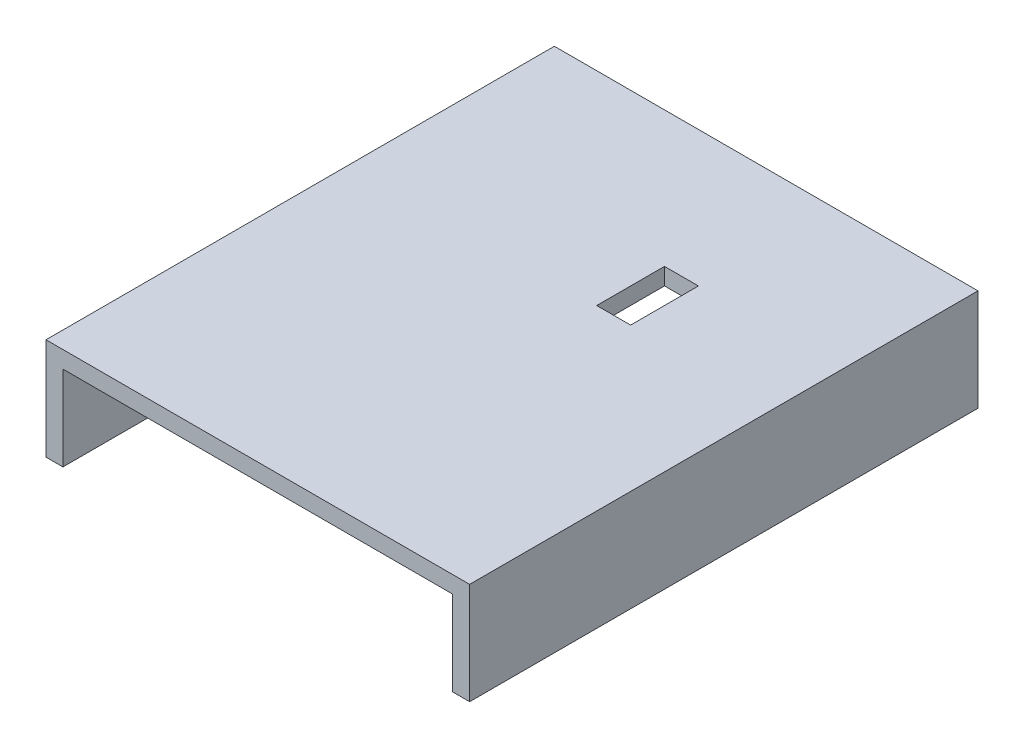
ISO-10303-21;
HEADER;
FILE_DESCRIPTION(('STEP AP214'),'2;1');
FILE_NAME('part.step','',(''),(''),'','','');
FILE_SCHEMA(('AUTOMOTIVE_DESIGN { 1 0 10303 214 1 1 1 1 }'));
ENDSEC;
DATA;
#1=APPLICATION_CONTEXT('core data for automotive mechanical design processes');
#2=APPLICATION_PROTOCOL_DEFINITION('international standard','automotive_design',2000,#1);
#3=PRODUCT_CONTEXT('',#1,'mechanical');
#4=PRODUCT('Part','Part','',(#3));
#5=PRODUCT_RELATED_PRODUCT_CATEGORY('part','',(#4));
#6=PRODUCT_DEFINITION_FORMATION('','',#4);
#7=PRODUCT_DEFINITION_CONTEXT('part definition',#1,'design');
#8=PRODUCT_DEFINITION('design','',#6,#7);
#9=PRODUCT_DEFINITION_SHAPE('','',#8);
#10=(LENGTH_UNIT() NAMED_UNIT(*) SI_UNIT(.MILLI.,.METRE.));
#11=(NAMED_UNIT(*) PLANE_ANGLE_UNIT() SI_UNIT($,.RADIAN.));
#12=(NAMED_UNIT(*) SI_UNIT($,.STERADIAN.) SOLID_ANGLE_UNIT());
#13=UNCERTAINTY_MEASURE_WITH_UNIT(LENGTH_MEASURE(1.E-05),#10,'distance_accuracy_value','');
#14=(GEOMETRIC_REPRESENTATION_CONTEXT(3) GLOBAL_UNCERTAINTY_ASSIGNED_CONTEXT((#13)) GLOBAL_UNIT_ASSIGNED_CONTEXT((#10,
#11,#12)) REPRESENTATION_CONTEXT('',''));
#15=CARTESIAN_POINT('',(0.,0.,0.));
#16=DIRECTION('',(0.,0.,1.));
#17=DIRECTION('',(1.,0.,0.));
#18=AXIS2_PLACEMENT_3D('',#15,#16,#17);
#19=CARTESIAN_POINT('',(0.,0.,0.));
#20=DIRECTION('',(0.,-1.,0.));
#21=DIRECTION('',(0.,0.,-1.));
#22=AXIS2_PLACEMENT_3D('',#19,#20,#21);
#23=PLANE('',#22);
#24=DIRECTION('',(1.,0.,0.));
#25=VECTOR('',#24,1.);
#26=CARTESIAN_POINT('',(20.,0.,-30.));
#27=LINE('',#26,#25);
#28=CARTESIAN_POINT('',(20.,0.,-30.));
#29=VERTEX_POINT('',#28);
#30=CARTESIAN_POINT('',(40.,0.,-30.));
#31=VERTEX_POINT('',#30);
#32=EDGE_CURVE('E174',#29,#31,#27,.T.);
#33=ORIENTED_EDGE('',*,*,#32,.T.);
#34=DIRECTION('',(0.,0.,-1.));
#35=VECTOR('',#34,1.);
#36=CARTESIAN_POINT('',(40.,0.,-30.));
#37=LINE('',#36,#35);
#38=CARTESIAN_POINT('',(40.,0.,-70.));
#39=VERTEX_POINT('',#38);
#40=EDGE_CURVE('E170',#31,#39,#37,.T.);
#41=ORIENTED_EDGE('',*,*,#40,.T.);
#42=DIRECTION('',(-1.,0.,0.));
#43=VECTOR('',#42,1.);
#44=CARTESIAN_POINT('',(20.,0.,-70.));
#45=LINE('',#44,#43);
#46=CARTESIAN_POINT('',(20.,0.,-70.));
#47=VERTEX_POINT('',#46);
#48=EDGE_CURVE('E184',#39,#47,#45,.T.);
#49=ORIENTED_EDGE('',*,*,#48,.T.);
#50=DIRECTION('',(0.,0.,1.));
#51=VECTOR('',#50,1.);
#52=CARTESIAN_POINT('',(20.,0.,-30.));
#53=LINE('',#52,#51);
#54=EDGE_CURVE('E187',#47,#29,#53,.T.);
#55=ORIENTED_EDGE('',*,*,#54,.T.);
#56=EDGE_LOOP('',(#33,#41,#49,#55));
#57=FACE_BOUND('',#56,.T.);
#58=DIRECTION('',(1.,0.,0.));
#59=VECTOR('',#58,1.);
#60=CARTESIAN_POINT('',(-125.,0.,150.));
#61=LINE('',#60,#59);
#62=CARTESIAN_POINT('',(-115.,0.,150.));
#63=VERTEX_POINT('',#62);
#64=CARTESIAN_POINT('',(115.,0.,150.));
#65=VERTEX_POINT('',#64);
#66=EDGE_CURVE('E53',#63,#65,#61,.T.);
#67=ORIENTED_EDGE('',*,*,#66,.F.);
#68=DIRECTION('',(0.,0.,1.));
#69=VECTOR('',#68,1.);
#70=CARTESIAN_POINT('',(-115.,0.,150.));
#71=LINE('',#70,#69);
#72=CARTESIAN_POINT('',(-115.,0.,-150.));
#73=VERTEX_POINT('',#72);
#74=EDGE_CURVE('E143',#73,#63,#71,.T.);
#75=ORIENTED_EDGE('',*,*,#74,.F.);
#76=DIRECTION('',(-1.,0.,0.));
#77=VECTOR('',#76,1.);
#78=CARTESIAN_POINT('',(-125.,0.,-150.));
#79=LINE('',#78,#77);
#80=CARTESIAN_POINT('',(115.,0.,-150.));
#81=VERTEX_POINT('',#80);
#82=EDGE_CURVE('E201',#81,#73,#79,.T.);
#83=ORIENTED_EDGE('',*,*,#82,.F.);
#84=DIRECTION('',(0.,0.,-1.));
#85=VECTOR('',#84,1.);
#86=CARTESIAN_POINT('',(115.,0.,150.));
#87=LINE('',#86,#85);
#88=EDGE_CURVE('E151',#65,#81,#87,.T.);
#89=ORIENTED_EDGE('',*,*,#88,.F.);
#90=EDGE_LOOP('',(#67,#75,#83,#89));
#91=FACE_BOUND('',#90,.T.);
#92=ADVANCED_FACE('F33',(#57,#91),#23,.T.);
#93=CARTESIAN_POINT('',(0.,10.,0.));
#94=DIRECTION('',(0.,-1.,0.));
#95=DIRECTION('',(0.,0.,-1.));
#96=AXIS2_PLACEMENT_3D('',#93,#94,#95);
#97=PLANE('',#96);
#98=DIRECTION('',(0.,0.,-1.));
#99=VECTOR('',#98,1.);
#100=CARTESIAN_POINT('',(125.,10.,150.));
#101=LINE('',#100,#99);
#102=CARTESIAN_POINT('',(125.,10.,150.));
#103=VERTEX_POINT('',#102);
#104=CARTESIAN_POINT('',(125.,10.,-150.));
#105=VERTEX_POINT('',#104);
#106=EDGE_CURVE('E202',#103,#105,#101,.T.);
#107=ORIENTED_EDGE('',*,*,#106,.T.);
#108=DIRECTION('',(-1.,0.,0.));
#109=VECTOR('',#108,1.);
#110=CARTESIAN_POINT('',(-125.,10.,-150.));
#111=LINE('',#110,#109);
#112=CARTESIAN_POINT('',(-125.,10.,-150.));
#113=VERTEX_POINT('',#112);
#114=EDGE_CURVE('E205',#105,#113,#111,.T.);
#115=ORIENTED_EDGE('',*,*,#114,.T.);
#116=DIRECTION('',(0.,0.,1.));
#117=VECTOR('',#116,1.);
#118=CARTESIAN_POINT('',(-125.,10.,150.));
#119=LINE('',#118,#117);
#120=CARTESIAN_POINT('',(-125.,10.,150.));
#121=VERTEX_POINT('',#120);
#122=EDGE_CURVE('E128',#113,#121,#119,.T.);
#123=ORIENTED_EDGE('',*,*,#122,.T.);
#124=DIRECTION('',(1.,0.,0.));
#125=VECTOR('',#124,1.);
#126=CARTESIAN_POINT('',(-125.,10.,150.));
#127=LINE('',#126,#125);
#128=EDGE_CURVE('E208',#121,#103,#127,.T.);
#129=ORIENTED_EDGE('',*,*,#128,.T.);
#130=EDGE_LOOP('',(#107,#115,#123,#129));
#131=FACE_BOUND('',#130,.T.);
#132=DIRECTION('',(0.,0.,-1.));
#133=VECTOR('',#132,1.);
#134=CARTESIAN_POINT('',(40.,10.,-30.));
#135=LINE('',#134,#133);
#136=CARTESIAN_POINT('',(40.,10.,-30.));
#137=VERTEX_POINT('',#136);
#138=CARTESIAN_POINT('',(40.,10.,-70.));
#139=VERTEX_POINT('',#138);
#140=EDGE_CURVE('E171',#137,#139,#135,.T.);
#141=ORIENTED_EDGE('',*,*,#140,.F.);
#142=DIRECTION('',(1.,0.,0.));
#143=VECTOR('',#142,1.);
#144=CARTESIAN_POINT('',(20.,10.,-30.));
#145=LINE('',#144,#143);
#146=CARTESIAN_POINT('',(20.,10.,-30.));
#147=VERTEX_POINT('',#146);
#148=EDGE_CURVE('E179',#147,#137,#145,.T.);
#149=ORIENTED_EDGE('',*,*,#148,.F.);
#150=DIRECTION('',(0.,0.,1.));
#151=VECTOR('',#150,1.);
#152=CARTESIAN_POINT('',(20.,10.,-30.));
#153=LINE('',#152,#151);
#154=CARTESIAN_POINT('',(20.,10.,-70.));
#155=VERTEX_POINT('',#154);
#156=EDGE_CURVE('E176',#155,#147,#153,.T.);
#157=ORIENTED_EDGE('',*,*,#156,.F.);
#158=DIRECTION('',(-1.,0.,0.));
#159=VECTOR('',#158,1.);
#160=CARTESIAN_POINT('',(20.,10.,-70.));
#161=LINE('',#160,#159);
#162=EDGE_CURVE('E173',#139,#155,#161,.T.);
#163=ORIENTED_EDGE('',*,*,#162,.F.);
#164=EDGE_LOOP('',(#141,#149,#157,#163));
#165=FACE_BOUND('',#164,.T.);
#166=ADVANCED_FACE('F220',(#131,#165),#97,.F.);
#167=CARTESIAN_POINT('',(125.,10.,150.));
#168=DIRECTION('',(-1.,0.,0.));
#169=DIRECTION('',(0.,0.,1.));
#170=AXIS2_PLACEMENT_3D('',#167,#168,#169);
#171=PLANE('',#170);
#172=DIRECTION('',(0.,-1.,0.));
#173=VECTOR('',#172,1.);
#174=CARTESIAN_POINT('',(125.,10.,150.));
#175=LINE('',#174,#173);
#176=CARTESIAN_POINT('',(125.,-50.,150.));
#177=VERTEX_POINT('',#176);
#178=EDGE_CURVE('E210',#103,#177,#175,.T.);
#179=ORIENTED_EDGE('',*,*,#178,.T.);
#180=DIRECTION('',(0.,0.,1.));
#181=VECTOR('',#180,1.);
#182=CARTESIAN_POINT('',(125.,-50.,150.));
#183=LINE('',#182,#181);
#184=CARTESIAN_POINT('',(125.,-50.,-150.));
#185=VERTEX_POINT('',#184);
#186=EDGE_CURVE('E152',#185,#177,#183,.T.);
#187=ORIENTED_EDGE('',*,*,#186,.F.);
#188=DIRECTION('',(0.,-1.,0.));
#189=VECTOR('',#188,1.);
#190=CARTESIAN_POINT('',(125.,10.,-150.));
#191=LINE('',#190,#189);
#192=EDGE_CURVE('E11',#105,#185,#191,.T.);
#193=ORIENTED_EDGE('',*,*,#192,.F.);
#194=ORIENTED_EDGE('',*,*,#106,.F.);
#195=EDGE_LOOP('',(#179,#187,#193,#194));
#196=FACE_BOUND('',#195,.T.);
#197=ADVANCED_FACE('F35',(#196),#171,.F.);
#198=CARTESIAN_POINT('',(-125.,10.,-150.));
#199=DIRECTION('',(0.,0.,1.));
#200=DIRECTION('',(1.,0.,0.));
#201=AXIS2_PLACEMENT_3D('',#198,#199,#200);
#202=PLANE('',#201);
#203=ORIENTED_EDGE('',*,*,#192,.T.);
#204=DIRECTION('',(1.,0.,0.));
#205=VECTOR('',#204,1.);
#206=CARTESIAN_POINT('',(125.,-50.,-150.));
#207=LINE('',#206,#205);
#208=CARTESIAN_POINT('',(115.,-50.,-150.));
#209=VERTEX_POINT('',#208);
#210=EDGE_CURVE('E159',#209,#185,#207,.T.);
#211=ORIENTED_EDGE('',*,*,#210,.F.);
#212=DIRECTION('',(0.,1.,0.));
#213=VECTOR('',#212,1.);
#214=CARTESIAN_POINT('',(115.,-50.,-150.));
#215=LINE('',#214,#213);
#216=EDGE_CURVE('E162',#209,#81,#215,.T.);
#217=ORIENTED_EDGE('',*,*,#216,.T.);
#218=ORIENTED_EDGE('',*,*,#82,.T.);
#219=DIRECTION('',(0.,1.,0.));
#220=VECTOR('',#219,1.);
#221=CARTESIAN_POINT('',(-115.,-50.,-150.));
#222=LINE('',#221,#220);
#223=CARTESIAN_POINT('',(-115.,-50.,-150.));
#224=VERTEX_POINT('',#223);
#225=EDGE_CURVE('E135',#224,#73,#222,.T.);
#226=ORIENTED_EDGE('',*,*,#225,.F.);
#227=DIRECTION('',(1.,0.,0.));
#228=VECTOR('',#227,1.);
#229=CARTESIAN_POINT('',(-125.,-50.,-150.));
#230=LINE('',#229,#228);
#231=CARTESIAN_POINT('',(-125.,-50.,-150.));
#232=VERTEX_POINT('',#231);
#233=EDGE_CURVE('E132',#232,#224,#230,.T.);
#234=ORIENTED_EDGE('',*,*,#233,.F.);
#235=DIRECTION('',(0.,-1.,0.));
#236=VECTOR('',#235,1.);
#237=CARTESIAN_POINT('',(-125.,10.,-150.));
#238=LINE('',#237,#236);
#239=EDGE_CURVE('E41',#113,#232,#238,.T.);
#240=ORIENTED_EDGE('',*,*,#239,.F.);
#241=ORIENTED_EDGE('',*,*,#114,.F.);
#242=EDGE_LOOP('',(#203,#211,#217,#218,#226,#234,#240,#241));
#243=FACE_BOUND('',#242,.T.);
#244=ADVANCED_FACE('F133',(#243),#202,.F.);
#245=CARTESIAN_POINT('',(-125.,10.,150.));
#246=DIRECTION('',(1.,0.,0.));
#247=DIRECTION('',(0.,0.,-1.));
#248=AXIS2_PLACEMENT_3D('',#245,#246,#247);
#249=PLANE('',#248);
#250=ORIENTED_EDGE('',*,*,#239,.T.);
#251=DIRECTION('',(0.,0.,-1.));
#252=VECTOR('',#251,1.);
#253=CARTESIAN_POINT('',(-125.,-50.,150.));
#254=LINE('',#253,#252);
#255=CARTESIAN_POINT('',(-125.,-50.,150.));
#256=VERTEX_POINT('',#255);
#257=EDGE_CURVE('E127',#256,#232,#254,.T.);
#258=ORIENTED_EDGE('',*,*,#257,.F.);
#259=DIRECTION('',(0.,-1.,0.));
#260=VECTOR('',#259,1.);
#261=CARTESIAN_POINT('',(-125.,10.,150.));
#262=LINE('',#261,#260);
#263=EDGE_CURVE('E130',#121,#256,#262,.T.);
#264=ORIENTED_EDGE('',*,*,#263,.F.);
#265=ORIENTED_EDGE('',*,*,#122,.F.);
#266=EDGE_LOOP('',(#250,#258,#264,#265));
#267=FACE_BOUND('',#266,.T.);
#268=ADVANCED_FACE('F124',(#267),#249,.F.);
#269=CARTESIAN_POINT('',(-125.,10.,150.));
#270=DIRECTION('',(0.,0.,-1.));
#271=DIRECTION('',(-1.,0.,0.));
#272=AXIS2_PLACEMENT_3D('',#269,#270,#271);
#273=PLANE('',#272);
#274=ORIENTED_EDGE('',*,*,#263,.T.);
#275=DIRECTION('',(-1.,0.,0.));
#276=VECTOR('',#275,1.);
#277=CARTESIAN_POINT('',(-125.,-50.,150.));
#278=LINE('',#277,#276);
#279=CARTESIAN_POINT('',(-115.,-50.,150.));
#280=VERTEX_POINT('',#279);
#281=EDGE_CURVE('E142',#280,#256,#278,.T.);
#282=ORIENTED_EDGE('',*,*,#281,.F.);
#283=DIRECTION('',(0.,1.,0.));
#284=VECTOR('',#283,1.);
#285=CARTESIAN_POINT('',(-115.,-50.,150.));
#286=LINE('',#285,#284);
#287=EDGE_CURVE('E48',#280,#63,#286,.T.);
#288=ORIENTED_EDGE('',*,*,#287,.T.);
#289=ORIENTED_EDGE('',*,*,#66,.T.);
#290=DIRECTION('',(0.,1.,0.));
#291=VECTOR('',#290,1.);
#292=CARTESIAN_POINT('',(115.,-50.,150.));
#293=LINE('',#292,#291);
#294=CARTESIAN_POINT('',(115.,-50.,150.));
#295=VERTEX_POINT('',#294);
#296=EDGE_CURVE('E167',#295,#65,#293,.T.);
#297=ORIENTED_EDGE('',*,*,#296,.F.);
#298=DIRECTION('',(-1.,0.,0.));
#299=VECTOR('',#298,1.);
#300=CARTESIAN_POINT('',(125.,-50.,150.));
#301=LINE('',#300,#299);
#302=EDGE_CURVE('E155',#177,#295,#301,.T.);
#303=ORIENTED_EDGE('',*,*,#302,.F.);
#304=ORIENTED_EDGE('',*,*,#178,.F.);
#305=ORIENTED_EDGE('',*,*,#128,.F.);
#306=EDGE_LOOP('',(#274,#282,#288,#289,#297,#303,#304,#305));
#307=FACE_BOUND('',#306,.T.);
#308=ADVANCED_FACE('F215',(#307),#273,.F.);
#309=CARTESIAN_POINT('',(40.,10.,-30.));
#310=DIRECTION('',(-1.,0.,0.));
#311=DIRECTION('',(0.,0.,1.));
#312=AXIS2_PLACEMENT_3D('',#309,#310,#311);
#313=PLANE('',#312);
#314=ORIENTED_EDGE('',*,*,#40,.F.);
#315=DIRECTION('',(0.,-1.,0.));
#316=VECTOR('',#315,1.);
#317=CARTESIAN_POINT('',(40.,10.,-30.));
#318=LINE('',#317,#316);
#319=EDGE_CURVE('E181',#137,#31,#318,.T.);
#320=ORIENTED_EDGE('',*,*,#319,.F.);
#321=ORIENTED_EDGE('',*,*,#140,.T.);
#322=DIRECTION('',(0.,-1.,0.));
#323=VECTOR('',#322,1.);
#324=CARTESIAN_POINT('',(40.,10.,-70.));
#325=LINE('',#324,#323);
#326=EDGE_CURVE('E198',#139,#39,#325,.T.);
#327=ORIENTED_EDGE('',*,*,#326,.T.);
#328=EDGE_LOOP('',(#314,#320,#321,#327));
#329=FACE_BOUND('',#328,.T.);
#330=ADVANCED_FACE('F255',(#329),#313,.T.);
#331=CARTESIAN_POINT('',(20.,10.,-70.));
#332=DIRECTION('',(0.,0.,1.));
#333=DIRECTION('',(1.,0.,0.));
#334=AXIS2_PLACEMENT_3D('',#331,#332,#333);
#335=PLANE('',#334);
#336=ORIENTED_EDGE('',*,*,#48,.F.);
#337=ORIENTED_EDGE('',*,*,#326,.F.);
#338=ORIENTED_EDGE('',*,*,#162,.T.);
#339=DIRECTION('',(0.,-1.,0.));
#340=VECTOR('',#339,1.);
#341=CARTESIAN_POINT('',(20.,10.,-70.));
#342=LINE('',#341,#340);
#343=EDGE_CURVE('E196',#155,#47,#342,.T.);
#344=ORIENTED_EDGE('',*,*,#343,.T.);
#345=EDGE_LOOP('',(#336,#337,#338,#344));
#346=FACE_BOUND('',#345,.T.);
#347=ADVANCED_FACE('F277',(#346),#335,.T.);
#348=CARTESIAN_POINT('',(20.,10.,-30.));
#349=DIRECTION('',(1.,0.,0.));
#350=DIRECTION('',(0.,0.,-1.));
#351=AXIS2_PLACEMENT_3D('',#348,#349,#350);
#352=PLANE('',#351);
#353=ORIENTED_EDGE('',*,*,#54,.F.);
#354=ORIENTED_EDGE('',*,*,#343,.F.);
#355=ORIENTED_EDGE('',*,*,#156,.T.);
#356=DIRECTION('',(0.,-1.,0.));
#357=VECTOR('',#356,1.);
#358=CARTESIAN_POINT('',(20.,10.,-30.));
#359=LINE('',#358,#357);
#360=EDGE_CURVE('E194',#147,#29,#359,.T.);
#361=ORIENTED_EDGE('',*,*,#360,.T.);
#362=EDGE_LOOP('',(#353,#354,#355,#361));
#363=FACE_BOUND('',#362,.T.);
#364=ADVANCED_FACE('F287',(#363),#352,.T.);
#365=CARTESIAN_POINT('',(20.,10.,-30.));
#366=DIRECTION('',(0.,0.,-1.));
#367=DIRECTION('',(-1.,0.,0.));
#368=AXIS2_PLACEMENT_3D('',#365,#366,#367);
#369=PLANE('',#368);
#370=ORIENTED_EDGE('',*,*,#32,.F.);
#371=ORIENTED_EDGE('',*,*,#360,.F.);
#372=ORIENTED_EDGE('',*,*,#148,.T.);
#373=ORIENTED_EDGE('',*,*,#319,.T.);
#374=EDGE_LOOP('',(#370,#371,#372,#373));
#375=FACE_BOUND('',#374,.T.);
#376=ADVANCED_FACE('F297',(#375),#369,.T.);
#377=CARTESIAN_POINT('',(115.,-50.,150.));
#378=DIRECTION('',(1.,0.,0.));
#379=DIRECTION('',(0.,0.,-1.));
#380=AXIS2_PLACEMENT_3D('',#377,#378,#379);
#381=PLANE('',#380);
#382=ORIENTED_EDGE('',*,*,#88,.T.);
#383=ORIENTED_EDGE('',*,*,#216,.F.);
#384=DIRECTION('',(0.,0.,-1.));
#385=VECTOR('',#384,1.);
#386=CARTESIAN_POINT('',(115.,-50.,150.));
#387=LINE('',#386,#385);
#388=EDGE_CURVE('E157',#295,#209,#387,.T.);
#389=ORIENTED_EDGE('',*,*,#388,.F.);
#390=ORIENTED_EDGE('',*,*,#296,.T.);
#391=EDGE_LOOP('',(#382,#383,#389,#390));
#392=FACE_BOUND('',#391,.T.);
#393=ADVANCED_FACE('F231',(#392),#381,.F.);
#394=CARTESIAN_POINT('',(0.,-50.,0.));
#395=DIRECTION('',(0.,1.,0.));
#396=DIRECTION('',(0.,0.,1.));
#397=AXIS2_PLACEMENT_3D('',#394,#395,#396);
#398=PLANE('',#397);
#399=ORIENTED_EDGE('',*,*,#186,.T.);
#400=ORIENTED_EDGE('',*,*,#302,.T.);
#401=ORIENTED_EDGE('',*,*,#388,.T.);
#402=ORIENTED_EDGE('',*,*,#210,.T.);
#403=EDGE_LOOP('',(#399,#400,#401,#402));
#404=FACE_BOUND('',#403,.T.);
#405=ADVANCED_FACE('F227',(#404),#398,.F.);
#406=CARTESIAN_POINT('',(-115.,-50.,150.));
#407=DIRECTION('',(-1.,0.,0.));
#408=DIRECTION('',(0.,0.,1.));
#409=AXIS2_PLACEMENT_3D('',#406,#407,#408);
#410=PLANE('',#409);
#411=ORIENTED_EDGE('',*,*,#74,.T.);
#412=ORIENTED_EDGE('',*,*,#287,.F.);
#413=DIRECTION('',(0.,0.,1.));
#414=VECTOR('',#413,1.);
#415=CARTESIAN_POINT('',(-115.,-50.,150.));
#416=LINE('',#415,#414);
#417=EDGE_CURVE('E138',#224,#280,#416,.T.);
#418=ORIENTED_EDGE('',*,*,#417,.F.);
#419=ORIENTED_EDGE('',*,*,#225,.T.);
#420=EDGE_LOOP('',(#411,#412,#418,#419));
#421=FACE_BOUND('',#420,.T.);
#422=ADVANCED_FACE('F235',(#421),#410,.F.);
#423=CARTESIAN_POINT('',(0.,-50.,0.));
#424=DIRECTION('',(0.,-1.,0.));
#425=DIRECTION('',(0.,0.,-1.));
#426=AXIS2_PLACEMENT_3D('',#423,#424,#425);
#427=PLANE('',#426);
#428=ORIENTED_EDGE('',*,*,#257,.T.);
#429=ORIENTED_EDGE('',*,*,#233,.T.);
#430=ORIENTED_EDGE('',*,*,#417,.T.);
#431=ORIENTED_EDGE('',*,*,#281,.T.);
#432=EDGE_LOOP('',(#428,#429,#430,#431));
#433=FACE_BOUND('',#432,.T.);
#434=ADVANCED_FACE('F141',(#433),#427,.T.);
#435=CLOSED_SHELL('',(#92,#166,#197,#244,#268,#308,#330,#347,#364,#376,#393,#405,#422,#434));
#436=MANIFOLD_SOLID_BREP('B2',#435);
#437=ADVANCED_BREP_SHAPE_REPRESENTATION('',(#18,#436),#14);
#438=SHAPE_DEFINITION_REPRESENTATION(#9,#437);
ENDSEC;
END-ISO-10303-21;
